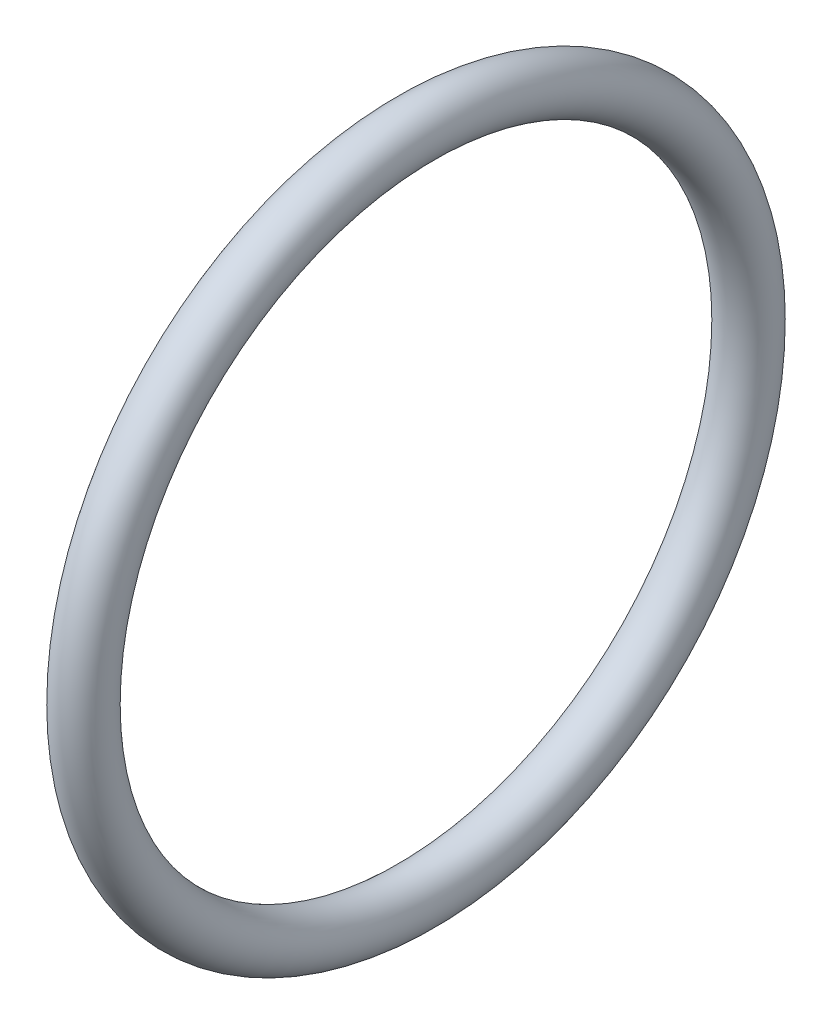
ISO-10303-21;
HEADER;
FILE_DESCRIPTION(('STEP AP214'),'2;1');
FILE_NAME('part.step','',(''),(''),'','','');
FILE_SCHEMA(('AUTOMOTIVE_DESIGN { 1 0 10303 214 1 1 1 1 }'));
ENDSEC;
DATA;
#1=APPLICATION_CONTEXT('core data for automotive mechanical design processes');
#2=APPLICATION_PROTOCOL_DEFINITION('international standard','automotive_design',2000,#1);
#3=PRODUCT_CONTEXT('',#1,'mechanical');
#4=PRODUCT('Part','Part','',(#3));
#5=PRODUCT_RELATED_PRODUCT_CATEGORY('part','',(#4));
#6=PRODUCT_DEFINITION_FORMATION('','',#4);
#7=PRODUCT_DEFINITION_CONTEXT('part definition',#1,'design');
#8=PRODUCT_DEFINITION('design','',#6,#7);
#9=PRODUCT_DEFINITION_SHAPE('','',#8);
#10=(LENGTH_UNIT() NAMED_UNIT(*) SI_UNIT(.MILLI.,.METRE.));
#11=(NAMED_UNIT(*) PLANE_ANGLE_UNIT() SI_UNIT($,.RADIAN.));
#12=(NAMED_UNIT(*) SI_UNIT($,.STERADIAN.) SOLID_ANGLE_UNIT());
#13=UNCERTAINTY_MEASURE_WITH_UNIT(LENGTH_MEASURE(1.E-05),#10,'distance_accuracy_value','');
#14=(GEOMETRIC_REPRESENTATION_CONTEXT(3) GLOBAL_UNCERTAINTY_ASSIGNED_CONTEXT((#13)) GLOBAL_UNIT_ASSIGNED_CONTEXT((#10,
#11,#12)) REPRESENTATION_CONTEXT('',''));
#15=CARTESIAN_POINT('',(0.,0.,0.));
#16=DIRECTION('',(0.,0.,1.));
#17=DIRECTION('',(1.,0.,0.));
#18=AXIS2_PLACEMENT_3D('',#15,#16,#17);
#19=CARTESIAN_POINT('',(0.75,0.,0.));
#20=DIRECTION('',(1.,0.,0.));
#21=DIRECTION('',(0.,0.,-1.));
#22=AXIS2_PLACEMENT_3D('',#19,#20,#21);
#23=TOROIDAL_SURFACE('',#22,9.6,0.75);
#24=CARTESIAN_POINT('',(0.750000000000001,0.,-10.35));
#25=VERTEX_POINT('',#24);
#26=VERTEX_LOOP('',#25);
#27=FACE_BOUND('',#26,.T.);
#28=ADVANCED_FACE('F13',(#27),#23,.T.);
#29=CLOSED_SHELL('',(#28));
#30=MANIFOLD_SOLID_BREP('B1',#29);
#31=ADVANCED_BREP_SHAPE_REPRESENTATION('',(#18,#30),#14);
#32=SHAPE_DEFINITION_REPRESENTATION(#9,#31);
ENDSEC;
END-ISO-10303-21;
